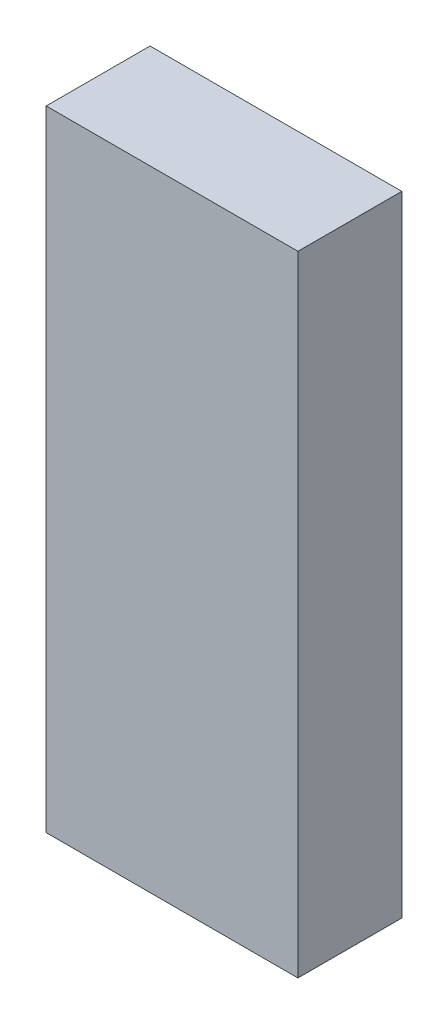
ISO-10303-21;
HEADER;
FILE_DESCRIPTION(('STEP AP214'),'2;1');
FILE_NAME('part.step','',(''),(''),'','','');
FILE_SCHEMA(('AUTOMOTIVE_DESIGN { 1 0 10303 214 1 1 1 1 }'));
ENDSEC;
DATA;
#1=APPLICATION_CONTEXT('core data for automotive mechanical design processes');
#2=APPLICATION_PROTOCOL_DEFINITION('international standard','automotive_design',2000,#1);
#3=PRODUCT_CONTEXT('',#1,'mechanical');
#4=PRODUCT('Part','Part','',(#3));
#5=PRODUCT_RELATED_PRODUCT_CATEGORY('part','',(#4));
#6=PRODUCT_DEFINITION_FORMATION('','',#4);
#7=PRODUCT_DEFINITION_CONTEXT('part definition',#1,'design');
#8=PRODUCT_DEFINITION('design','',#6,#7);
#9=PRODUCT_DEFINITION_SHAPE('','',#8);
#10=(LENGTH_UNIT() NAMED_UNIT(*) SI_UNIT(.MILLI.,.METRE.));
#11=(NAMED_UNIT(*) PLANE_ANGLE_UNIT() SI_UNIT($,.RADIAN.));
#12=(NAMED_UNIT(*) SI_UNIT($,.STERADIAN.) SOLID_ANGLE_UNIT());
#13=UNCERTAINTY_MEASURE_WITH_UNIT(LENGTH_MEASURE(1.E-05),#10,'distance_accuracy_value','');
#14=(GEOMETRIC_REPRESENTATION_CONTEXT(3) GLOBAL_UNCERTAINTY_ASSIGNED_CONTEXT((#13)) GLOBAL_UNIT_ASSIGNED_CONTEXT((#10,
#11,#12)) REPRESENTATION_CONTEXT('',''));
#15=CARTESIAN_POINT('',(0.,0.,0.));
#16=DIRECTION('',(0.,0.,1.));
#17=DIRECTION('',(1.,0.,0.));
#18=AXIS2_PLACEMENT_3D('',#15,#16,#17);
#19=CARTESIAN_POINT('',(-1.99999854,5.00000016,0.));
#20=DIRECTION('',(1.,0.,0.));
#21=DIRECTION('',(0.,-1.,0.));
#22=AXIS2_PLACEMENT_3D('',#19,#20,#21);
#23=PLANE('',#22);
#24=DIRECTION('',(0.,-1.,0.));
#25=VECTOR('',#24,1.);
#26=CARTESIAN_POINT('',(-1.99999854,5.00000016,0.));
#27=LINE('',#26,#25);
#28=CARTESIAN_POINT('',(-1.99999854,5.00000016,0.));
#29=VERTEX_POINT('',#28);
#30=CARTESIAN_POINT('',(-1.99999854,-5.00000016,0.));
#31=VERTEX_POINT('',#30);
#32=EDGE_CURVE('E11',#29,#31,#27,.T.);
#33=ORIENTED_EDGE('',*,*,#32,.T.);
#34=DIRECTION('',(0.,0.,1.));
#35=VECTOR('',#34,1.);
#36=CARTESIAN_POINT('',(-1.99999854,-5.00000016,0.));
#37=LINE('',#36,#35);
#38=CARTESIAN_POINT('',(-1.99999854,-5.00000016,1.64999924));
#39=VERTEX_POINT('',#38);
#40=EDGE_CURVE('E24',#31,#39,#37,.T.);
#41=ORIENTED_EDGE('',*,*,#40,.T.);
#42=DIRECTION('',(0.,-1.,0.));
#43=VECTOR('',#42,1.);
#44=CARTESIAN_POINT('',(-1.99999854,5.00000016,1.64999924));
#45=LINE('',#44,#43);
#46=CARTESIAN_POINT('',(-1.99999854,5.00000016,1.64999924));
#47=VERTEX_POINT('',#46);
#48=EDGE_CURVE('E87',#47,#39,#45,.T.);
#49=ORIENTED_EDGE('',*,*,#48,.F.);
#50=DIRECTION('',(0.,0.,1.));
#51=VECTOR('',#50,1.);
#52=CARTESIAN_POINT('',(-1.99999854,5.00000016,0.));
#53=LINE('',#52,#51);
#54=EDGE_CURVE('E36',#29,#47,#53,.T.);
#55=ORIENTED_EDGE('',*,*,#54,.F.);
#56=EDGE_LOOP('',(#33,#41,#49,#55));
#57=FACE_BOUND('',#56,.T.);
#58=ADVANCED_FACE('F17',(#57),#23,.F.);
#59=CARTESIAN_POINT('',(-1.99999854,-5.00000016,0.));
#60=DIRECTION('',(0.,1.,0.));
#61=DIRECTION('',(1.,0.,0.));
#62=AXIS2_PLACEMENT_3D('',#59,#60,#61);
#63=PLANE('',#62);
#64=DIRECTION('',(1.,0.,0.));
#65=VECTOR('',#64,1.);
#66=CARTESIAN_POINT('',(-1.99999854,-5.00000016,0.));
#67=LINE('',#66,#65);
#68=CARTESIAN_POINT('',(2.00000108,-5.00000016,0.));
#69=VERTEX_POINT('',#68);
#70=EDGE_CURVE('E84',#31,#69,#67,.T.);
#71=ORIENTED_EDGE('',*,*,#70,.T.);
#72=DIRECTION('',(0.,0.,1.));
#73=VECTOR('',#72,1.);
#74=CARTESIAN_POINT('',(2.00000108,-5.00000016,0.));
#75=LINE('',#74,#73);
#76=CARTESIAN_POINT('',(2.00000108,-5.00000016,1.64999924));
#77=VERTEX_POINT('',#76);
#78=EDGE_CURVE('E82',#69,#77,#75,.T.);
#79=ORIENTED_EDGE('',*,*,#78,.T.);
#80=DIRECTION('',(1.,0.,0.));
#81=VECTOR('',#80,1.);
#82=CARTESIAN_POINT('',(-1.99999854,-5.00000016,1.64999924));
#83=LINE('',#82,#81);
#84=EDGE_CURVE('E62',#39,#77,#83,.T.);
#85=ORIENTED_EDGE('',*,*,#84,.F.);
#86=ORIENTED_EDGE('',*,*,#40,.F.);
#87=EDGE_LOOP('',(#71,#79,#85,#86));
#88=FACE_BOUND('',#87,.T.);
#89=ADVANCED_FACE('F89',(#88),#63,.F.);
#90=CARTESIAN_POINT('',(2.00000108,-5.00000016,0.));
#91=DIRECTION('',(-1.,0.,0.));
#92=DIRECTION('',(0.,1.,0.));
#93=AXIS2_PLACEMENT_3D('',#90,#91,#92);
#94=PLANE('',#93);
#95=DIRECTION('',(0.,1.,0.));
#96=VECTOR('',#95,1.);
#97=CARTESIAN_POINT('',(2.00000108,-5.00000016,0.));
#98=LINE('',#97,#96);
#99=CARTESIAN_POINT('',(2.00000108,5.00000016,0.));
#100=VERTEX_POINT('',#99);
#101=EDGE_CURVE('E71',#69,#100,#98,.T.);
#102=ORIENTED_EDGE('',*,*,#101,.T.);
#103=DIRECTION('',(0.,0.,1.));
#104=VECTOR('',#103,1.);
#105=CARTESIAN_POINT('',(2.00000108,5.00000016,0.));
#106=LINE('',#105,#104);
#107=CARTESIAN_POINT('',(2.00000108,5.00000016,1.64999924));
#108=VERTEX_POINT('',#107);
#109=EDGE_CURVE('E65',#100,#108,#106,.T.);
#110=ORIENTED_EDGE('',*,*,#109,.T.);
#111=DIRECTION('',(0.,1.,0.));
#112=VECTOR('',#111,1.);
#113=CARTESIAN_POINT('',(2.00000108,-5.00000016,1.64999924));
#114=LINE('',#113,#112);
#115=EDGE_CURVE('E57',#77,#108,#114,.T.);
#116=ORIENTED_EDGE('',*,*,#115,.F.);
#117=ORIENTED_EDGE('',*,*,#78,.F.);
#118=EDGE_LOOP('',(#102,#110,#116,#117));
#119=FACE_BOUND('',#118,.T.);
#120=ADVANCED_FACE('F69',(#119),#94,.F.);
#121=CARTESIAN_POINT('',(2.00000108,5.00000016,0.));
#122=DIRECTION('',(0.,-1.,0.));
#123=DIRECTION('',(-1.,0.,0.));
#124=AXIS2_PLACEMENT_3D('',#121,#122,#123);
#125=PLANE('',#124);
#126=DIRECTION('',(-1.,0.,0.));
#127=VECTOR('',#126,1.);
#128=CARTESIAN_POINT('',(2.00000108,5.00000016,0.));
#129=LINE('',#128,#127);
#130=EDGE_CURVE('E66',#100,#29,#129,.T.);
#131=ORIENTED_EDGE('',*,*,#130,.T.);
#132=ORIENTED_EDGE('',*,*,#54,.T.);
#133=DIRECTION('',(-1.,0.,0.));
#134=VECTOR('',#133,1.);
#135=CARTESIAN_POINT('',(2.00000108,5.00000016,1.64999924));
#136=LINE('',#135,#134);
#137=EDGE_CURVE('E61',#108,#47,#136,.T.);
#138=ORIENTED_EDGE('',*,*,#137,.F.);
#139=ORIENTED_EDGE('',*,*,#109,.F.);
#140=EDGE_LOOP('',(#131,#132,#138,#139));
#141=FACE_BOUND('',#140,.T.);
#142=ADVANCED_FACE('F76',(#141),#125,.F.);
#143=CARTESIAN_POINT('',(1.270000003831E-06,0.,0.));
#144=DIRECTION('',(0.,0.,1.));
#145=DIRECTION('',(1.,0.,0.));
#146=AXIS2_PLACEMENT_3D('',#143,#144,#145);
#147=PLANE('',#146);
#148=ORIENTED_EDGE('',*,*,#130,.F.);
#149=ORIENTED_EDGE('',*,*,#101,.F.);
#150=ORIENTED_EDGE('',*,*,#70,.F.);
#151=ORIENTED_EDGE('',*,*,#32,.F.);
#152=EDGE_LOOP('',(#148,#149,#150,#151));
#153=FACE_BOUND('',#152,.T.);
#154=ADVANCED_FACE('F91',(#153),#147,.F.);
#155=CARTESIAN_POINT('',(1.270000003831E-06,0.,1.64999924));
#156=DIRECTION('',(0.,0.,1.));
#157=DIRECTION('',(1.,0.,0.));
#158=AXIS2_PLACEMENT_3D('',#155,#156,#157);
#159=PLANE('',#158);
#160=ORIENTED_EDGE('',*,*,#48,.T.);
#161=ORIENTED_EDGE('',*,*,#84,.T.);
#162=ORIENTED_EDGE('',*,*,#115,.T.);
#163=ORIENTED_EDGE('',*,*,#137,.T.);
#164=EDGE_LOOP('',(#160,#161,#162,#163));
#165=FACE_BOUND('',#164,.T.);
#166=ADVANCED_FACE('F59',(#165),#159,.T.);
#167=CLOSED_SHELL('',(#58,#89,#120,#142,#154,#166));
#168=MANIFOLD_SOLID_BREP('B1',#167);
#169=ADVANCED_BREP_SHAPE_REPRESENTATION('',(#18,#168),#14);
#170=SHAPE_DEFINITION_REPRESENTATION(#9,#169);
ENDSEC;
END-ISO-10303-21;
